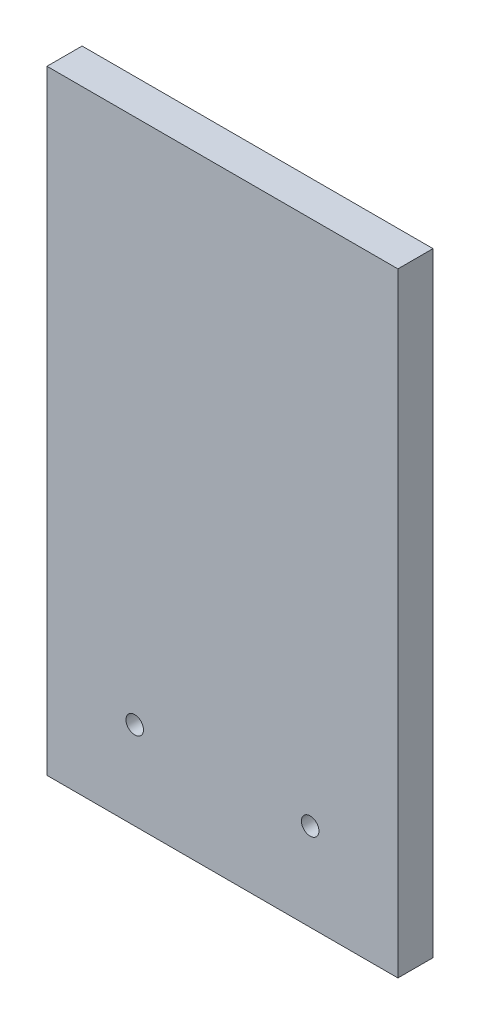
ISO-10303-21;
HEADER;
FILE_DESCRIPTION(('STEP AP214'),'2;1');
FILE_NAME('part.step','',(''),(''),'','','');
FILE_SCHEMA(('AUTOMOTIVE_DESIGN { 1 0 10303 214 1 1 1 1 }'));
ENDSEC;
DATA;
#1=APPLICATION_CONTEXT('core data for automotive mechanical design processes');
#2=APPLICATION_PROTOCOL_DEFINITION('international standard','automotive_design',2000,#1);
#3=PRODUCT_CONTEXT('',#1,'mechanical');
#4=PRODUCT('Part','Part','',(#3));
#5=PRODUCT_RELATED_PRODUCT_CATEGORY('part','',(#4));
#6=PRODUCT_DEFINITION_FORMATION('','',#4);
#7=PRODUCT_DEFINITION_CONTEXT('part definition',#1,'design');
#8=PRODUCT_DEFINITION('design','',#6,#7);
#9=PRODUCT_DEFINITION_SHAPE('','',#8);
#10=(LENGTH_UNIT() NAMED_UNIT(*) SI_UNIT(.MILLI.,.METRE.));
#11=(NAMED_UNIT(*) PLANE_ANGLE_UNIT() SI_UNIT($,.RADIAN.));
#12=(NAMED_UNIT(*) SI_UNIT($,.STERADIAN.) SOLID_ANGLE_UNIT());
#13=UNCERTAINTY_MEASURE_WITH_UNIT(LENGTH_MEASURE(1.E-05),#10,'distance_accuracy_value','');
#14=(GEOMETRIC_REPRESENTATION_CONTEXT(3) GLOBAL_UNCERTAINTY_ASSIGNED_CONTEXT((#13)) GLOBAL_UNIT_ASSIGNED_CONTEXT((#10,
#11,#12)) REPRESENTATION_CONTEXT('',''));
#15=CARTESIAN_POINT('',(0.,0.,0.));
#16=DIRECTION('',(0.,0.,1.));
#17=DIRECTION('',(1.,0.,0.));
#18=AXIS2_PLACEMENT_3D('',#15,#16,#17);
#19=CARTESIAN_POINT('',(95.8435698673757,73.8591664540981,1.));
#20=DIRECTION('',(-1.,0.,0.));
#21=DIRECTION('',(0.,0.,1.));
#22=AXIS2_PLACEMENT_3D('',#19,#20,#21);
#23=PLANE('',#22);
#24=DIRECTION('',(0.,1.,0.));
#25=VECTOR('',#24,1.);
#26=CARTESIAN_POINT('',(95.8435698673757,73.8591664540981,0.));
#27=LINE('',#26,#25);
#28=CARTESIAN_POINT('',(95.8435698673757,56.3591664540981,0.));
#29=VERTEX_POINT('',#28);
#30=CARTESIAN_POINT('',(95.8435698673757,73.8591664540981,0.));
#31=VERTEX_POINT('',#30);
#32=EDGE_CURVE('E107',#29,#31,#27,.T.);
#33=ORIENTED_EDGE('',*,*,#32,.T.);
#34=DIRECTION('',(0.,0.,-1.));
#35=VECTOR('',#34,1.);
#36=CARTESIAN_POINT('',(95.8435698673757,73.8591664540981,1.));
#37=LINE('',#36,#35);
#38=CARTESIAN_POINT('',(95.8435698673757,73.8591664540981,1.));
#39=VERTEX_POINT('',#38);
#40=EDGE_CURVE('E11',#39,#31,#37,.T.);
#41=ORIENTED_EDGE('',*,*,#40,.F.);
#42=DIRECTION('',(0.,1.,0.));
#43=VECTOR('',#42,1.);
#44=CARTESIAN_POINT('',(95.8435698673757,73.8591664540981,1.));
#45=LINE('',#44,#43);
#46=CARTESIAN_POINT('',(95.8435698673757,56.3591664540981,1.));
#47=VERTEX_POINT('',#46);
#48=EDGE_CURVE('E91',#47,#39,#45,.T.);
#49=ORIENTED_EDGE('',*,*,#48,.F.);
#50=DIRECTION('',(0.,0.,-1.));
#51=VECTOR('',#50,1.);
#52=CARTESIAN_POINT('',(95.8435698673757,56.3591664540981,1.));
#53=LINE('',#52,#51);
#54=EDGE_CURVE('E103',#47,#29,#53,.T.);
#55=ORIENTED_EDGE('',*,*,#54,.T.);
#56=EDGE_LOOP('',(#33,#41,#49,#55));
#57=FACE_BOUND('',#56,.T.);
#58=ADVANCED_FACE('F39',(#57),#23,.F.);
#59=CARTESIAN_POINT('',(95.8435698673757,73.8591664540981,1.));
#60=DIRECTION('',(0.,-1.,0.));
#61=DIRECTION('',(0.,0.,-1.));
#62=AXIS2_PLACEMENT_3D('',#59,#60,#61);
#63=PLANE('',#62);
#64=DIRECTION('',(-1.,0.,0.));
#65=VECTOR('',#64,1.);
#66=CARTESIAN_POINT('',(95.8435698673757,73.8591664540981,0.));
#67=LINE('',#66,#65);
#68=CARTESIAN_POINT('',(85.8435698673757,73.8591664540981,0.));
#69=VERTEX_POINT('',#68);
#70=EDGE_CURVE('E96',#31,#69,#67,.T.);
#71=ORIENTED_EDGE('',*,*,#70,.T.);
#72=DIRECTION('',(0.,0.,-1.));
#73=VECTOR('',#72,1.);
#74=CARTESIAN_POINT('',(85.8435698673757,73.8591664540981,1.));
#75=LINE('',#74,#73);
#76=CARTESIAN_POINT('',(85.8435698673757,73.8591664540981,1.));
#77=VERTEX_POINT('',#76);
#78=EDGE_CURVE('E48',#77,#69,#75,.T.);
#79=ORIENTED_EDGE('',*,*,#78,.F.);
#80=DIRECTION('',(-1.,0.,0.));
#81=VECTOR('',#80,1.);
#82=CARTESIAN_POINT('',(95.8435698673757,73.8591664540981,1.));
#83=LINE('',#82,#81);
#84=EDGE_CURVE('E86',#39,#77,#83,.T.);
#85=ORIENTED_EDGE('',*,*,#84,.F.);
#86=ORIENTED_EDGE('',*,*,#40,.T.);
#87=EDGE_LOOP('',(#71,#79,#85,#86));
#88=FACE_BOUND('',#87,.T.);
#89=ADVANCED_FACE('F95',(#88),#63,.F.);
#90=CARTESIAN_POINT('',(85.8435698673757,73.8591664540981,1.));
#91=DIRECTION('',(1.,0.,0.));
#92=DIRECTION('',(0.,0.,-1.));
#93=AXIS2_PLACEMENT_3D('',#90,#91,#92);
#94=PLANE('',#93);
#95=DIRECTION('',(0.,-1.,0.));
#96=VECTOR('',#95,1.);
#97=CARTESIAN_POINT('',(85.8435698673757,73.8591664540981,0.));
#98=LINE('',#97,#96);
#99=CARTESIAN_POINT('',(85.8435698673757,56.3591664540981,0.));
#100=VERTEX_POINT('',#99);
#101=EDGE_CURVE('E73',#69,#100,#98,.T.);
#102=ORIENTED_EDGE('',*,*,#101,.T.);
#103=DIRECTION('',(0.,0.,-1.));
#104=VECTOR('',#103,1.);
#105=CARTESIAN_POINT('',(85.8435698673757,56.3591664540981,1.));
#106=LINE('',#105,#104);
#107=CARTESIAN_POINT('',(85.8435698673757,56.3591664540981,1.));
#108=VERTEX_POINT('',#107);
#109=EDGE_CURVE('E98',#108,#100,#106,.T.);
#110=ORIENTED_EDGE('',*,*,#109,.F.);
#111=DIRECTION('',(0.,-1.,0.));
#112=VECTOR('',#111,1.);
#113=CARTESIAN_POINT('',(85.8435698673757,73.8591664540981,1.));
#114=LINE('',#113,#112);
#115=EDGE_CURVE('E89',#77,#108,#114,.T.);
#116=ORIENTED_EDGE('',*,*,#115,.F.);
#117=ORIENTED_EDGE('',*,*,#78,.T.);
#118=EDGE_LOOP('',(#102,#110,#116,#117));
#119=FACE_BOUND('',#118,.T.);
#120=ADVANCED_FACE('F99',(#119),#94,.F.);
#121=CARTESIAN_POINT('',(95.8435698673757,56.3591664540981,1.));
#122=DIRECTION('',(0.,1.,0.));
#123=DIRECTION('',(0.,0.,1.));
#124=AXIS2_PLACEMENT_3D('',#121,#122,#123);
#125=PLANE('',#124);
#126=DIRECTION('',(1.,0.,0.));
#127=VECTOR('',#126,1.);
#128=CARTESIAN_POINT('',(95.8435698673757,56.3591664540981,0.));
#129=LINE('',#128,#127);
#130=EDGE_CURVE('E79',#100,#29,#129,.T.);
#131=ORIENTED_EDGE('',*,*,#130,.T.);
#132=ORIENTED_EDGE('',*,*,#54,.F.);
#133=DIRECTION('',(1.,0.,0.));
#134=VECTOR('',#133,1.);
#135=CARTESIAN_POINT('',(95.8435698673757,56.3591664540981,1.));
#136=LINE('',#135,#134);
#137=EDGE_CURVE('E56',#108,#47,#136,.T.);
#138=ORIENTED_EDGE('',*,*,#137,.F.);
#139=ORIENTED_EDGE('',*,*,#109,.T.);
#140=EDGE_LOOP('',(#131,#132,#138,#139));
#141=FACE_BOUND('',#140,.T.);
#142=ADVANCED_FACE('F121',(#141),#125,.F.);
#143=CARTESIAN_POINT('',(0.,0.,1.));
#144=DIRECTION('',(0.,0.,-1.));
#145=DIRECTION('',(-1.,0.,0.));
#146=AXIS2_PLACEMENT_3D('',#143,#144,#145);
#147=PLANE('',#146);
#148=CARTESIAN_POINT('',(88.3435698673757,58.8591664540981,1.));
#149=DIRECTION('',(0.,0.,1.));
#150=DIRECTION('',(1.,0.,0.));
#151=AXIS2_PLACEMENT_3D('',#148,#149,#150);
#152=CIRCLE('',#151,0.25);
#153=CARTESIAN_POINT('',(88.5935698673757,58.8591664540981,1.));
#154=VERTEX_POINT('',#153);
#155=EDGE_CURVE('E136',#154,#154,#152,.T.);
#156=ORIENTED_EDGE('',*,*,#155,.F.);
#157=EDGE_LOOP('',(#156));
#158=FACE_BOUND('',#157,.T.);
#159=CARTESIAN_POINT('',(93.3435698673757,58.8591664540981,1.));
#160=DIRECTION('',(0.,0.,1.));
#161=DIRECTION('',(1.,0.,0.));
#162=AXIS2_PLACEMENT_3D('',#159,#160,#161);
#163=CIRCLE('',#162,0.25);
#164=CARTESIAN_POINT('',(93.5935698673757,58.8591664540981,1.));
#165=VERTEX_POINT('',#164);
#166=EDGE_CURVE('E132',#165,#165,#163,.T.);
#167=ORIENTED_EDGE('',*,*,#166,.F.);
#168=EDGE_LOOP('',(#167));
#169=FACE_BOUND('',#168,.T.);
#170=ORIENTED_EDGE('',*,*,#48,.T.);
#171=ORIENTED_EDGE('',*,*,#84,.T.);
#172=ORIENTED_EDGE('',*,*,#115,.T.);
#173=ORIENTED_EDGE('',*,*,#137,.T.);
#174=EDGE_LOOP('',(#170,#171,#172,#173));
#175=FACE_BOUND('',#174,.T.);
#176=ADVANCED_FACE('F87',(#158,#169,#175),#147,.F.);
#177=CARTESIAN_POINT('',(0.,0.,0.));
#178=DIRECTION('',(0.,0.,-1.));
#179=DIRECTION('',(-1.,0.,0.));
#180=AXIS2_PLACEMENT_3D('',#177,#178,#179);
#181=PLANE('',#180);
#182=CARTESIAN_POINT('',(88.3435698673757,58.8591664540981,0.));
#183=DIRECTION('',(0.,0.,1.));
#184=DIRECTION('',(1.,0.,0.));
#185=AXIS2_PLACEMENT_3D('',#182,#183,#184);
#186=CIRCLE('',#185,0.25);
#187=CARTESIAN_POINT('',(88.5935698673757,58.8591664540981,0.));
#188=VERTEX_POINT('',#187);
#189=EDGE_CURVE('E111',#188,#188,#186,.T.);
#190=ORIENTED_EDGE('',*,*,#189,.T.);
#191=EDGE_LOOP('',(#190));
#192=FACE_BOUND('',#191,.T.);
#193=CARTESIAN_POINT('',(93.3435698673757,58.8591664540981,0.));
#194=DIRECTION('',(0.,0.,1.));
#195=DIRECTION('',(1.,0.,0.));
#196=AXIS2_PLACEMENT_3D('',#193,#194,#195);
#197=CIRCLE('',#196,0.25);
#198=CARTESIAN_POINT('',(93.5935698673757,58.8591664540981,0.));
#199=VERTEX_POINT('',#198);
#200=EDGE_CURVE('E128',#199,#199,#197,.T.);
#201=ORIENTED_EDGE('',*,*,#200,.T.);
#202=EDGE_LOOP('',(#201));
#203=FACE_BOUND('',#202,.T.);
#204=ORIENTED_EDGE('',*,*,#32,.F.);
#205=ORIENTED_EDGE('',*,*,#130,.F.);
#206=ORIENTED_EDGE('',*,*,#101,.F.);
#207=ORIENTED_EDGE('',*,*,#70,.F.);
#208=EDGE_LOOP('',(#204,#205,#206,#207));
#209=FACE_BOUND('',#208,.T.);
#210=ADVANCED_FACE('F124',(#192,#203,#209),#181,.T.);
#211=CARTESIAN_POINT('',(93.3435698673757,58.8591664540981,0.));
#212=DIRECTION('',(0.,0.,1.));
#213=DIRECTION('',(1.,0.,0.));
#214=AXIS2_PLACEMENT_3D('',#211,#212,#213);
#215=CYLINDRICAL_SURFACE('',#214,0.25);
#216=ORIENTED_EDGE('',*,*,#200,.F.);
#217=EDGE_LOOP('',(#216));
#218=FACE_BOUND('',#217,.T.);
#219=ORIENTED_EDGE('',*,*,#166,.T.);
#220=EDGE_LOOP('',(#219));
#221=FACE_BOUND('',#220,.T.);
#222=ADVANCED_FACE('F149',(#218,#221),#215,.F.);
#223=CARTESIAN_POINT('',(88.3435698673757,58.8591664540981,0.));
#224=DIRECTION('',(0.,0.,1.));
#225=DIRECTION('',(1.,0.,0.));
#226=AXIS2_PLACEMENT_3D('',#223,#224,#225);
#227=CYLINDRICAL_SURFACE('',#226,0.25);
#228=ORIENTED_EDGE('',*,*,#189,.F.);
#229=EDGE_LOOP('',(#228));
#230=FACE_BOUND('',#229,.T.);
#231=ORIENTED_EDGE('',*,*,#155,.T.);
#232=EDGE_LOOP('',(#231));
#233=FACE_BOUND('',#232,.T.);
#234=ADVANCED_FACE('F146',(#230,#233),#227,.F.);
#235=CLOSED_SHELL('',(#58,#89,#120,#142,#176,#210,#222,#234));
#236=MANIFOLD_SOLID_BREP('B2',#235);
#237=ADVANCED_BREP_SHAPE_REPRESENTATION('',(#18,#236),#14);
#238=SHAPE_DEFINITION_REPRESENTATION(#9,#237);
ENDSEC;
END-ISO-10303-21;
